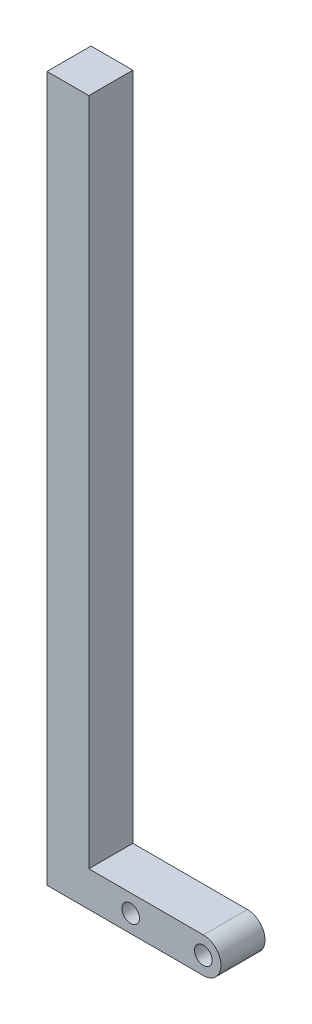
ISO-10303-21;
HEADER;
FILE_DESCRIPTION(('STEP AP214'),'2;1');
FILE_NAME('part.step','',(''),(''),'','','');
FILE_SCHEMA(('AUTOMOTIVE_DESIGN { 1 0 10303 214 1 1 1 1 }'));
ENDSEC;
DATA;
#1=APPLICATION_CONTEXT('core data for automotive mechanical design processes');
#2=APPLICATION_PROTOCOL_DEFINITION('international standard','automotive_design',2000,#1);
#3=PRODUCT_CONTEXT('',#1,'mechanical');
#4=PRODUCT('Part','Part','',(#3));
#5=PRODUCT_RELATED_PRODUCT_CATEGORY('part','',(#4));
#6=PRODUCT_DEFINITION_FORMATION('','',#4);
#7=PRODUCT_DEFINITION_CONTEXT('part definition',#1,'design');
#8=PRODUCT_DEFINITION('design','',#6,#7);
#9=PRODUCT_DEFINITION_SHAPE('','',#8);
#10=(LENGTH_UNIT() NAMED_UNIT(*) SI_UNIT(.MILLI.,.METRE.));
#11=(NAMED_UNIT(*) PLANE_ANGLE_UNIT() SI_UNIT($,.RADIAN.));
#12=(NAMED_UNIT(*) SI_UNIT($,.STERADIAN.) SOLID_ANGLE_UNIT());
#13=UNCERTAINTY_MEASURE_WITH_UNIT(LENGTH_MEASURE(1.E-05),#10,'distance_accuracy_value','');
#14=(GEOMETRIC_REPRESENTATION_CONTEXT(3) GLOBAL_UNCERTAINTY_ASSIGNED_CONTEXT((#13)) GLOBAL_UNIT_ASSIGNED_CONTEXT((#10,
#11,#12)) REPRESENTATION_CONTEXT('',''));
#15=CARTESIAN_POINT('',(0.,0.,0.));
#16=DIRECTION('',(0.,0.,1.));
#17=DIRECTION('',(1.,0.,0.));
#18=AXIS2_PLACEMENT_3D('',#15,#16,#17);
#19=CARTESIAN_POINT('',(8.25,0.,5.));
#20=DIRECTION('',(0.,0.,1.));
#21=DIRECTION('',(1.,0.,0.));
#22=AXIS2_PLACEMENT_3D('',#19,#20,#21);
#23=PLANE('',#22);
#24=CARTESIAN_POINT('',(0.,0.,5.));
#25=DIRECTION('',(0.,0.,1.));
#26=DIRECTION('',(1.,0.,0.));
#27=AXIS2_PLACEMENT_3D('',#24,#25,#26);
#28=CIRCLE('',#27,1.);
#29=CARTESIAN_POINT('',(1.,0.,5.));
#30=VERTEX_POINT('',#29);
#31=EDGE_CURVE('E130',#30,#30,#28,.T.);
#32=ORIENTED_EDGE('',*,*,#31,.F.);
#33=EDGE_LOOP('',(#32));
#34=FACE_BOUND('',#33,.T.);
#35=DIRECTION('',(-1.,0.,0.));
#36=VECTOR('',#35,1.);
#37=CARTESIAN_POINT('',(-4.74999999999999,2.,5.));
#38=LINE('',#37,#36);
#39=CARTESIAN_POINT('',(8.25,2.,5.));
#40=VERTEX_POINT('',#39);
#41=CARTESIAN_POINT('',(-4.74999999999999,2.,5.));
#42=VERTEX_POINT('',#41);
#43=EDGE_CURVE('E55',#40,#42,#38,.T.);
#44=ORIENTED_EDGE('',*,*,#43,.T.);
#45=DIRECTION('',(0.,1.,0.));
#46=VECTOR('',#45,1.);
#47=CARTESIAN_POINT('',(-4.75,78.,5.));
#48=LINE('',#47,#46);
#49=CARTESIAN_POINT('',(-4.75,78.,5.));
#50=VERTEX_POINT('',#49);
#51=EDGE_CURVE('E92',#42,#50,#48,.T.);
#52=ORIENTED_EDGE('',*,*,#51,.T.);
#53=DIRECTION('',(-1.,0.,0.));
#54=VECTOR('',#53,1.);
#55=CARTESIAN_POINT('',(-9.5,78.,5.));
#56=LINE('',#55,#54);
#57=CARTESIAN_POINT('',(-9.5,78.,5.));
#58=VERTEX_POINT('',#57);
#59=EDGE_CURVE('E106',#50,#58,#56,.T.);
#60=ORIENTED_EDGE('',*,*,#59,.T.);
#61=DIRECTION('',(0.,-1.,0.));
#62=VECTOR('',#61,1.);
#63=CARTESIAN_POINT('',(-9.5,-2.,5.));
#64=LINE('',#63,#62);
#65=CARTESIAN_POINT('',(-9.5,-2.,5.));
#66=VERTEX_POINT('',#65);
#67=EDGE_CURVE('E100',#58,#66,#64,.T.);
#68=ORIENTED_EDGE('',*,*,#67,.T.);
#69=DIRECTION('',(1.,0.,0.));
#70=VECTOR('',#69,1.);
#71=CARTESIAN_POINT('',(-0.5,-2.,5.));
#72=LINE('',#71,#70);
#73=CARTESIAN_POINT('',(8.25,-2.,5.));
#74=VERTEX_POINT('',#73);
#75=EDGE_CURVE('E104',#66,#74,#72,.T.);
#76=ORIENTED_EDGE('',*,*,#75,.T.);
#77=CARTESIAN_POINT('',(8.25,0.,5.));
#78=DIRECTION('',(0.,0.,1.));
#79=DIRECTION('',(1.,0.,0.));
#80=AXIS2_PLACEMENT_3D('',#77,#78,#79);
#81=CIRCLE('',#80,2.);
#82=EDGE_CURVE('E121',#74,#40,#81,.T.);
#83=ORIENTED_EDGE('',*,*,#82,.T.);
#84=EDGE_LOOP('',(#44,#52,#60,#68,#76,#83));
#85=FACE_BOUND('',#84,.T.);
#86=CARTESIAN_POINT('',(8.25,0.,5.));
#87=DIRECTION('',(0.,0.,1.));
#88=DIRECTION('',(1.,0.,0.));
#89=AXIS2_PLACEMENT_3D('',#86,#87,#88);
#90=CIRCLE('',#89,1.);
#91=CARTESIAN_POINT('',(9.25,0.,5.));
#92=VERTEX_POINT('',#91);
#93=EDGE_CURVE('E156',#92,#92,#90,.T.);
#94=ORIENTED_EDGE('',*,*,#93,.F.);
#95=EDGE_LOOP('',(#94));
#96=FACE_BOUND('',#95,.T.);
#97=ADVANCED_FACE('F38',(#34,#85,#96),#23,.T.);
#98=CARTESIAN_POINT('',(8.25,0.,0.));
#99=DIRECTION('',(0.,0.,1.));
#100=DIRECTION('',(1.,0.,0.));
#101=AXIS2_PLACEMENT_3D('',#98,#99,#100);
#102=PLANE('',#101);
#103=DIRECTION('',(0.,1.,0.));
#104=VECTOR('',#103,1.);
#105=CARTESIAN_POINT('',(-4.75,78.,0.));
#106=LINE('',#105,#104);
#107=CARTESIAN_POINT('',(-4.74999999999999,2.,0.));
#108=VERTEX_POINT('',#107);
#109=CARTESIAN_POINT('',(-4.75,78.,0.));
#110=VERTEX_POINT('',#109);
#111=EDGE_CURVE('E127',#108,#110,#106,.T.);
#112=ORIENTED_EDGE('',*,*,#111,.F.);
#113=DIRECTION('',(-1.,0.,0.));
#114=VECTOR('',#113,1.);
#115=CARTESIAN_POINT('',(0.,2.,0.));
#116=LINE('',#115,#114);
#117=CARTESIAN_POINT('',(8.25,2.,0.));
#118=VERTEX_POINT('',#117);
#119=EDGE_CURVE('E135',#118,#108,#116,.T.);
#120=ORIENTED_EDGE('',*,*,#119,.F.);
#121=CARTESIAN_POINT('',(8.25,0.,0.));
#122=DIRECTION('',(0.,0.,1.));
#123=DIRECTION('',(1.,0.,0.));
#124=AXIS2_PLACEMENT_3D('',#121,#122,#123);
#125=CIRCLE('',#124,2.);
#126=CARTESIAN_POINT('',(8.25,-2.,0.));
#127=VERTEX_POINT('',#126);
#128=EDGE_CURVE('E85',#127,#118,#125,.T.);
#129=ORIENTED_EDGE('',*,*,#128,.F.);
#130=DIRECTION('',(1.,0.,0.));
#131=VECTOR('',#130,1.);
#132=CARTESIAN_POINT('',(8.25,-2.,0.));
#133=LINE('',#132,#131);
#134=CARTESIAN_POINT('',(-9.5,-2.,0.));
#135=VERTEX_POINT('',#134);
#136=EDGE_CURVE('E78',#135,#127,#133,.T.);
#137=ORIENTED_EDGE('',*,*,#136,.F.);
#138=DIRECTION('',(0.,-1.,0.));
#139=VECTOR('',#138,1.);
#140=CARTESIAN_POINT('',(-9.5,-2.,0.));
#141=LINE('',#140,#139);
#142=CARTESIAN_POINT('',(-9.5,78.,0.));
#143=VERTEX_POINT('',#142);
#144=EDGE_CURVE('E115',#143,#135,#141,.T.);
#145=ORIENTED_EDGE('',*,*,#144,.F.);
#146=DIRECTION('',(-1.,0.,0.));
#147=VECTOR('',#146,1.);
#148=CARTESIAN_POINT('',(-9.5,78.,0.));
#149=LINE('',#148,#147);
#150=EDGE_CURVE('E129',#110,#143,#149,.T.);
#151=ORIENTED_EDGE('',*,*,#150,.F.);
#152=EDGE_LOOP('',(#112,#120,#129,#137,#145,#151));
#153=FACE_BOUND('',#152,.T.);
#154=CARTESIAN_POINT('',(0.,0.,0.));
#155=DIRECTION('',(0.,0.,1.));
#156=DIRECTION('',(1.,0.,0.));
#157=AXIS2_PLACEMENT_3D('',#154,#155,#156);
#158=CIRCLE('',#157,1.);
#159=CARTESIAN_POINT('',(1.,0.,0.));
#160=VERTEX_POINT('',#159);
#161=EDGE_CURVE('E153',#160,#160,#158,.T.);
#162=ORIENTED_EDGE('',*,*,#161,.T.);
#163=EDGE_LOOP('',(#162));
#164=FACE_BOUND('',#163,.T.);
#165=CARTESIAN_POINT('',(8.25,0.,0.));
#166=DIRECTION('',(0.,0.,1.));
#167=DIRECTION('',(1.,0.,0.));
#168=AXIS2_PLACEMENT_3D('',#165,#166,#167);
#169=CIRCLE('',#168,1.);
#170=CARTESIAN_POINT('',(9.25,0.,0.));
#171=VERTEX_POINT('',#170);
#172=EDGE_CURVE('E159',#171,#171,#169,.T.);
#173=ORIENTED_EDGE('',*,*,#172,.T.);
#174=EDGE_LOOP('',(#173));
#175=FACE_BOUND('',#174,.T.);
#176=ADVANCED_FACE('F145',(#153,#164,#175),#102,.F.);
#177=CARTESIAN_POINT('',(-4.75,78.,5.));
#178=DIRECTION('',(-1.,0.,0.));
#179=DIRECTION('',(0.,-1.,0.));
#180=AXIS2_PLACEMENT_3D('',#177,#178,#179);
#181=PLANE('',#180);
#182=ORIENTED_EDGE('',*,*,#111,.T.);
#183=DIRECTION('',(0.,0.,-1.));
#184=VECTOR('',#183,1.);
#185=CARTESIAN_POINT('',(-4.75,78.,5.));
#186=LINE('',#185,#184);
#187=EDGE_CURVE('E47',#50,#110,#186,.T.);
#188=ORIENTED_EDGE('',*,*,#187,.F.);
#189=ORIENTED_EDGE('',*,*,#51,.F.);
#190=DIRECTION('',(0.,0.,-1.));
#191=VECTOR('',#190,1.);
#192=CARTESIAN_POINT('',(-4.74999999999999,2.,5.));
#193=LINE('',#192,#191);
#194=EDGE_CURVE('E11',#42,#108,#193,.T.);
#195=ORIENTED_EDGE('',*,*,#194,.T.);
#196=EDGE_LOOP('',(#182,#188,#189,#195));
#197=FACE_BOUND('',#196,.T.);
#198=ADVANCED_FACE('F40',(#197),#181,.F.);
#199=CARTESIAN_POINT('',(-9.5,78.,5.));
#200=DIRECTION('',(0.,-1.,0.));
#201=DIRECTION('',(0.,0.,-1.));
#202=AXIS2_PLACEMENT_3D('',#199,#200,#201);
#203=PLANE('',#202);
#204=ORIENTED_EDGE('',*,*,#150,.T.);
#205=DIRECTION('',(0.,0.,-1.));
#206=VECTOR('',#205,1.);
#207=CARTESIAN_POINT('',(-9.5,78.,5.));
#208=LINE('',#207,#206);
#209=EDGE_CURVE('E116',#58,#143,#208,.T.);
#210=ORIENTED_EDGE('',*,*,#209,.F.);
#211=ORIENTED_EDGE('',*,*,#59,.F.);
#212=ORIENTED_EDGE('',*,*,#187,.T.);
#213=EDGE_LOOP('',(#204,#210,#211,#212));
#214=FACE_BOUND('',#213,.T.);
#215=ADVANCED_FACE('F142',(#214),#203,.F.);
#216=CARTESIAN_POINT('',(-9.5,-2.,5.));
#217=DIRECTION('',(1.,0.,0.));
#218=DIRECTION('',(0.,1.,0.));
#219=AXIS2_PLACEMENT_3D('',#216,#217,#218);
#220=PLANE('',#219);
#221=ORIENTED_EDGE('',*,*,#144,.T.);
#222=DIRECTION('',(0.,0.,-1.));
#223=VECTOR('',#222,1.);
#224=CARTESIAN_POINT('',(-9.5,-2.,5.));
#225=LINE('',#224,#223);
#226=EDGE_CURVE('E112',#66,#135,#225,.T.);
#227=ORIENTED_EDGE('',*,*,#226,.F.);
#228=ORIENTED_EDGE('',*,*,#67,.F.);
#229=ORIENTED_EDGE('',*,*,#209,.T.);
#230=EDGE_LOOP('',(#221,#227,#228,#229));
#231=FACE_BOUND('',#230,.T.);
#232=ADVANCED_FACE('F113',(#231),#220,.F.);
#233=CARTESIAN_POINT('',(8.25,-2.,5.));
#234=DIRECTION('',(0.,1.,0.));
#235=DIRECTION('',(-1.,0.,0.));
#236=AXIS2_PLACEMENT_3D('',#233,#234,#235);
#237=PLANE('',#236);
#238=ORIENTED_EDGE('',*,*,#136,.T.);
#239=DIRECTION('',(0.,0.,-1.));
#240=VECTOR('',#239,1.);
#241=CARTESIAN_POINT('',(8.25,-2.,5.));
#242=LINE('',#241,#240);
#243=EDGE_CURVE('E117',#74,#127,#242,.T.);
#244=ORIENTED_EDGE('',*,*,#243,.F.);
#245=ORIENTED_EDGE('',*,*,#75,.F.);
#246=ORIENTED_EDGE('',*,*,#226,.T.);
#247=EDGE_LOOP('',(#238,#244,#245,#246));
#248=FACE_BOUND('',#247,.T.);
#249=ADVANCED_FACE('F119',(#248),#237,.F.);
#250=CARTESIAN_POINT('',(8.25,0.,5.));
#251=DIRECTION('',(0.,0.,-1.));
#252=DIRECTION('',(-1.,0.,0.));
#253=AXIS2_PLACEMENT_3D('',#250,#251,#252);
#254=CYLINDRICAL_SURFACE('',#253,2.);
#255=ORIENTED_EDGE('',*,*,#128,.T.);
#256=DIRECTION('',(0.,0.,-1.));
#257=VECTOR('',#256,1.);
#258=CARTESIAN_POINT('',(8.25,2.,5.));
#259=LINE('',#258,#257);
#260=EDGE_CURVE('E123',#40,#118,#259,.T.);
#261=ORIENTED_EDGE('',*,*,#260,.F.);
#262=ORIENTED_EDGE('',*,*,#82,.F.);
#263=ORIENTED_EDGE('',*,*,#243,.T.);
#264=EDGE_LOOP('',(#255,#261,#262,#263));
#265=FACE_BOUND('',#264,.T.);
#266=ADVANCED_FACE('F149',(#265),#254,.T.);
#267=CARTESIAN_POINT('',(0.,2.,5.));
#268=DIRECTION('',(0.,-1.,0.));
#269=DIRECTION('',(0.,0.,-1.));
#270=AXIS2_PLACEMENT_3D('',#267,#268,#269);
#271=PLANE('',#270);
#272=ORIENTED_EDGE('',*,*,#119,.T.);
#273=ORIENTED_EDGE('',*,*,#194,.F.);
#274=ORIENTED_EDGE('',*,*,#43,.F.);
#275=ORIENTED_EDGE('',*,*,#260,.T.);
#276=EDGE_LOOP('',(#272,#273,#274,#275));
#277=FACE_BOUND('',#276,.T.);
#278=ADVANCED_FACE('F148',(#277),#271,.F.);
#279=CARTESIAN_POINT('',(0.,0.,5.));
#280=DIRECTION('',(0.,0.,-1.));
#281=DIRECTION('',(-1.,0.,0.));
#282=AXIS2_PLACEMENT_3D('',#279,#280,#281);
#283=CYLINDRICAL_SURFACE('',#282,1.);
#284=ORIENTED_EDGE('',*,*,#31,.T.);
#285=EDGE_LOOP('',(#284));
#286=FACE_BOUND('',#285,.T.);
#287=ORIENTED_EDGE('',*,*,#161,.F.);
#288=EDGE_LOOP('',(#287));
#289=FACE_BOUND('',#288,.T.);
#290=ADVANCED_FACE('F176',(#286,#289),#283,.F.);
#291=CARTESIAN_POINT('',(8.25,0.,5.));
#292=DIRECTION('',(0.,0.,-1.));
#293=DIRECTION('',(-1.,0.,0.));
#294=AXIS2_PLACEMENT_3D('',#291,#292,#293);
#295=CYLINDRICAL_SURFACE('',#294,1.);
#296=ORIENTED_EDGE('',*,*,#93,.T.);
#297=EDGE_LOOP('',(#296));
#298=FACE_BOUND('',#297,.T.);
#299=ORIENTED_EDGE('',*,*,#172,.F.);
#300=EDGE_LOOP('',(#299));
#301=FACE_BOUND('',#300,.T.);
#302=ADVANCED_FACE('F165',(#298,#301),#295,.F.);
#303=CLOSED_SHELL('',(#97,#176,#198,#215,#232,#249,#266,#278,#290,#302));
#304=MANIFOLD_SOLID_BREP('B2',#303);
#305=ADVANCED_BREP_SHAPE_REPRESENTATION('',(#18,#304),#14);
#306=SHAPE_DEFINITION_REPRESENTATION(#9,#305);
ENDSEC;
END-ISO-10303-21;
